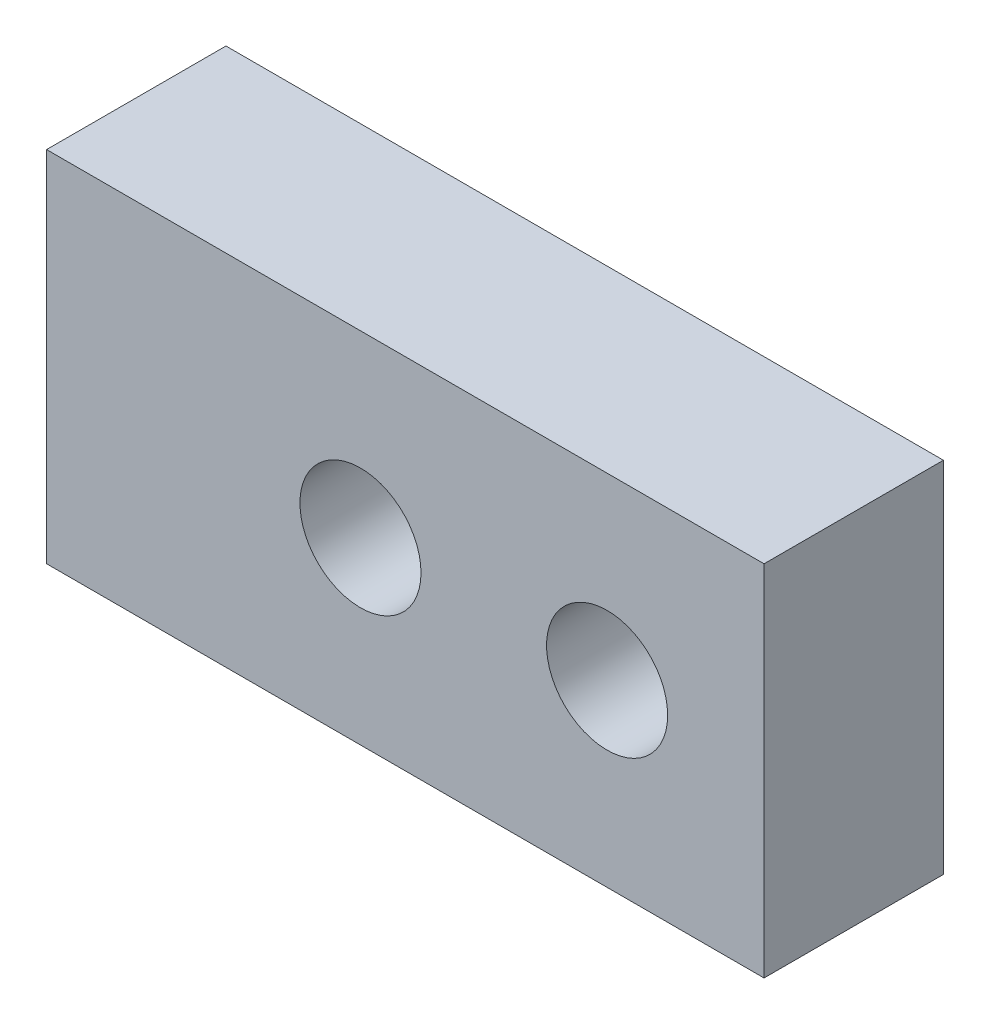
ISO-10303-21;
HEADER;
FILE_DESCRIPTION(('STEP AP214'),'2;1');
FILE_NAME('part.step','',(''),(''),'','','');
FILE_SCHEMA(('AUTOMOTIVE_DESIGN { 1 0 10303 214 1 1 1 1 }'));
ENDSEC;
DATA;
#1=APPLICATION_CONTEXT('core data for automotive mechanical design processes');
#2=APPLICATION_PROTOCOL_DEFINITION('international standard','automotive_design',2000,#1);
#3=PRODUCT_CONTEXT('',#1,'mechanical');
#4=PRODUCT('Part','Part','',(#3));
#5=PRODUCT_RELATED_PRODUCT_CATEGORY('part','',(#4));
#6=PRODUCT_DEFINITION_FORMATION('','',#4);
#7=PRODUCT_DEFINITION_CONTEXT('part definition',#1,'design');
#8=PRODUCT_DEFINITION('design','',#6,#7);
#9=PRODUCT_DEFINITION_SHAPE('','',#8);
#10=(LENGTH_UNIT() NAMED_UNIT(*) SI_UNIT(.MILLI.,.METRE.));
#11=(NAMED_UNIT(*) PLANE_ANGLE_UNIT() SI_UNIT($,.RADIAN.));
#12=(NAMED_UNIT(*) SI_UNIT($,.STERADIAN.) SOLID_ANGLE_UNIT());
#13=UNCERTAINTY_MEASURE_WITH_UNIT(LENGTH_MEASURE(1.E-05),#10,'distance_accuracy_value','');
#14=(GEOMETRIC_REPRESENTATION_CONTEXT(3) GLOBAL_UNCERTAINTY_ASSIGNED_CONTEXT((#13)) GLOBAL_UNIT_ASSIGNED_CONTEXT((#10,
#11,#12)) REPRESENTATION_CONTEXT('',''));
#15=CARTESIAN_POINT('',(0.,0.,0.));
#16=DIRECTION('',(0.,0.,1.));
#17=DIRECTION('',(1.,0.,0.));
#18=AXIS2_PLACEMENT_3D('',#15,#16,#17);
#19=CARTESIAN_POINT('',(0.,0.,4.));
#20=DIRECTION('',(0.,0.,-1.));
#21=DIRECTION('',(-1.,0.,0.));
#22=AXIS2_PLACEMENT_3D('',#19,#20,#21);
#23=PLANE('',#22);
#24=DIRECTION('',(0.,-1.,0.));
#25=VECTOR('',#24,1.);
#26=CARTESIAN_POINT('',(0.,0.,4.));
#27=LINE('',#26,#25);
#28=CARTESIAN_POINT('',(0.,8.,4.));
#29=VERTEX_POINT('',#28);
#30=CARTESIAN_POINT('',(0.,0.,4.));
#31=VERTEX_POINT('',#30);
#32=EDGE_CURVE('E92',#29,#31,#27,.T.);
#33=ORIENTED_EDGE('',*,*,#32,.T.);
#34=DIRECTION('',(1.,0.,0.));
#35=VECTOR('',#34,1.);
#36=CARTESIAN_POINT('',(0.,0.,4.));
#37=LINE('',#36,#35);
#38=CARTESIAN_POINT('',(16.,0.,4.));
#39=VERTEX_POINT('',#38);
#40=EDGE_CURVE('E87',#31,#39,#37,.T.);
#41=ORIENTED_EDGE('',*,*,#40,.T.);
#42=DIRECTION('',(0.,1.,0.));
#43=VECTOR('',#42,1.);
#44=CARTESIAN_POINT('',(16.,0.,4.));
#45=LINE('',#44,#43);
#46=CARTESIAN_POINT('',(16.,8.,4.));
#47=VERTEX_POINT('',#46);
#48=EDGE_CURVE('E90',#39,#47,#45,.T.);
#49=ORIENTED_EDGE('',*,*,#48,.T.);
#50=DIRECTION('',(-1.,0.,0.));
#51=VECTOR('',#50,1.);
#52=CARTESIAN_POINT('',(0.,8.,4.));
#53=LINE('',#52,#51);
#54=EDGE_CURVE('E57',#47,#29,#53,.T.);
#55=ORIENTED_EDGE('',*,*,#54,.T.);
#56=EDGE_LOOP('',(#33,#41,#49,#55));
#57=FACE_BOUND('',#56,.T.);
#58=CARTESIAN_POINT('',(12.5,4.,4.));
#59=DIRECTION('',(0.,0.,1.));
#60=DIRECTION('',(1.,0.,0.));
#61=AXIS2_PLACEMENT_3D('',#58,#59,#60);
#62=CIRCLE('',#61,1.35);
#63=CARTESIAN_POINT('',(13.85,4.,4.));
#64=VERTEX_POINT('',#63);
#65=EDGE_CURVE('E112',#64,#64,#62,.T.);
#66=ORIENTED_EDGE('',*,*,#65,.F.);
#67=EDGE_LOOP('',(#66));
#68=FACE_BOUND('',#67,.T.);
#69=CARTESIAN_POINT('',(7.,4.,4.));
#70=DIRECTION('',(0.,0.,1.));
#71=DIRECTION('',(1.,0.,0.));
#72=AXIS2_PLACEMENT_3D('',#69,#70,#71);
#73=CIRCLE('',#72,1.35);
#74=CARTESIAN_POINT('',(8.35,4.,4.));
#75=VERTEX_POINT('',#74);
#76=EDGE_CURVE('E134',#75,#75,#73,.T.);
#77=ORIENTED_EDGE('',*,*,#76,.F.);
#78=EDGE_LOOP('',(#77));
#79=FACE_BOUND('',#78,.T.);
#80=ADVANCED_FACE('F39',(#57,#68,#79),#23,.F.);
#81=CARTESIAN_POINT('',(0.,0.,0.));
#82=DIRECTION('',(0.,0.,-1.));
#83=DIRECTION('',(-1.,0.,0.));
#84=AXIS2_PLACEMENT_3D('',#81,#82,#83);
#85=PLANE('',#84);
#86=CARTESIAN_POINT('',(12.5,4.,0.));
#87=DIRECTION('',(0.,0.,1.));
#88=DIRECTION('',(1.,0.,0.));
#89=AXIS2_PLACEMENT_3D('',#86,#87,#88);
#90=CIRCLE('',#89,1.35);
#91=CARTESIAN_POINT('',(13.85,4.,0.));
#92=VERTEX_POINT('',#91);
#93=EDGE_CURVE('E130',#92,#92,#90,.T.);
#94=ORIENTED_EDGE('',*,*,#93,.T.);
#95=EDGE_LOOP('',(#94));
#96=FACE_BOUND('',#95,.T.);
#97=DIRECTION('',(0.,-1.,0.));
#98=VECTOR('',#97,1.);
#99=CARTESIAN_POINT('',(0.,0.,0.));
#100=LINE('',#99,#98);
#101=CARTESIAN_POINT('',(0.,8.,0.));
#102=VERTEX_POINT('',#101);
#103=CARTESIAN_POINT('',(0.,0.,0.));
#104=VERTEX_POINT('',#103);
#105=EDGE_CURVE('E108',#102,#104,#100,.T.);
#106=ORIENTED_EDGE('',*,*,#105,.F.);
#107=DIRECTION('',(-1.,0.,0.));
#108=VECTOR('',#107,1.);
#109=CARTESIAN_POINT('',(0.,8.,0.));
#110=LINE('',#109,#108);
#111=CARTESIAN_POINT('',(16.,8.,0.));
#112=VERTEX_POINT('',#111);
#113=EDGE_CURVE('E80',#112,#102,#110,.T.);
#114=ORIENTED_EDGE('',*,*,#113,.F.);
#115=DIRECTION('',(0.,1.,0.));
#116=VECTOR('',#115,1.);
#117=CARTESIAN_POINT('',(16.,0.,0.));
#118=LINE('',#117,#116);
#119=CARTESIAN_POINT('',(16.,0.,0.));
#120=VERTEX_POINT('',#119);
#121=EDGE_CURVE('E74',#120,#112,#118,.T.);
#122=ORIENTED_EDGE('',*,*,#121,.F.);
#123=DIRECTION('',(1.,0.,0.));
#124=VECTOR('',#123,1.);
#125=CARTESIAN_POINT('',(0.,0.,0.));
#126=LINE('',#125,#124);
#127=EDGE_CURVE('E97',#104,#120,#126,.T.);
#128=ORIENTED_EDGE('',*,*,#127,.F.);
#129=EDGE_LOOP('',(#106,#114,#122,#128));
#130=FACE_BOUND('',#129,.T.);
#131=CARTESIAN_POINT('',(7.,4.,0.));
#132=DIRECTION('',(0.,0.,1.));
#133=DIRECTION('',(1.,0.,0.));
#134=AXIS2_PLACEMENT_3D('',#131,#132,#133);
#135=CIRCLE('',#134,1.35);
#136=CARTESIAN_POINT('',(8.35,4.,0.));
#137=VERTEX_POINT('',#136);
#138=EDGE_CURVE('E138',#137,#137,#135,.T.);
#139=ORIENTED_EDGE('',*,*,#138,.T.);
#140=EDGE_LOOP('',(#139));
#141=FACE_BOUND('',#140,.T.);
#142=ADVANCED_FACE('F125',(#96,#130,#141),#85,.T.);
#143=CARTESIAN_POINT('',(0.,0.,4.));
#144=DIRECTION('',(1.,0.,0.));
#145=DIRECTION('',(0.,0.,-1.));
#146=AXIS2_PLACEMENT_3D('',#143,#144,#145);
#147=PLANE('',#146);
#148=ORIENTED_EDGE('',*,*,#105,.T.);
#149=DIRECTION('',(0.,0.,-1.));
#150=VECTOR('',#149,1.);
#151=CARTESIAN_POINT('',(0.,0.,4.));
#152=LINE('',#151,#150);
#153=EDGE_CURVE('E11',#31,#104,#152,.T.);
#154=ORIENTED_EDGE('',*,*,#153,.F.);
#155=ORIENTED_EDGE('',*,*,#32,.F.);
#156=DIRECTION('',(0.,0.,-1.));
#157=VECTOR('',#156,1.);
#158=CARTESIAN_POINT('',(0.,8.,4.));
#159=LINE('',#158,#157);
#160=EDGE_CURVE('E104',#29,#102,#159,.T.);
#161=ORIENTED_EDGE('',*,*,#160,.T.);
#162=EDGE_LOOP('',(#148,#154,#155,#161));
#163=FACE_BOUND('',#162,.T.);
#164=ADVANCED_FACE('F41',(#163),#147,.F.);
#165=CARTESIAN_POINT('',(0.,0.,4.));
#166=DIRECTION('',(0.,1.,0.));
#167=DIRECTION('',(0.,0.,1.));
#168=AXIS2_PLACEMENT_3D('',#165,#166,#167);
#169=PLANE('',#168);
#170=ORIENTED_EDGE('',*,*,#127,.T.);
#171=DIRECTION('',(0.,0.,-1.));
#172=VECTOR('',#171,1.);
#173=CARTESIAN_POINT('',(16.,0.,4.));
#174=LINE('',#173,#172);
#175=EDGE_CURVE('E49',#39,#120,#174,.T.);
#176=ORIENTED_EDGE('',*,*,#175,.F.);
#177=ORIENTED_EDGE('',*,*,#40,.F.);
#178=ORIENTED_EDGE('',*,*,#153,.T.);
#179=EDGE_LOOP('',(#170,#176,#177,#178));
#180=FACE_BOUND('',#179,.T.);
#181=ADVANCED_FACE('F96',(#180),#169,.F.);
#182=CARTESIAN_POINT('',(16.,0.,4.));
#183=DIRECTION('',(-1.,0.,0.));
#184=DIRECTION('',(0.,0.,1.));
#185=AXIS2_PLACEMENT_3D('',#182,#183,#184);
#186=PLANE('',#185);
#187=ORIENTED_EDGE('',*,*,#121,.T.);
#188=DIRECTION('',(0.,0.,-1.));
#189=VECTOR('',#188,1.);
#190=CARTESIAN_POINT('',(16.,8.,4.));
#191=LINE('',#190,#189);
#192=EDGE_CURVE('E99',#47,#112,#191,.T.);
#193=ORIENTED_EDGE('',*,*,#192,.F.);
#194=ORIENTED_EDGE('',*,*,#48,.F.);
#195=ORIENTED_EDGE('',*,*,#175,.T.);
#196=EDGE_LOOP('',(#187,#193,#194,#195));
#197=FACE_BOUND('',#196,.T.);
#198=ADVANCED_FACE('F100',(#197),#186,.F.);
#199=CARTESIAN_POINT('',(0.,8.,4.));
#200=DIRECTION('',(0.,-1.,0.));
#201=DIRECTION('',(0.,0.,-1.));
#202=AXIS2_PLACEMENT_3D('',#199,#200,#201);
#203=PLANE('',#202);
#204=ORIENTED_EDGE('',*,*,#113,.T.);
#205=ORIENTED_EDGE('',*,*,#160,.F.);
#206=ORIENTED_EDGE('',*,*,#54,.F.);
#207=ORIENTED_EDGE('',*,*,#192,.T.);
#208=EDGE_LOOP('',(#204,#205,#206,#207));
#209=FACE_BOUND('',#208,.T.);
#210=ADVANCED_FACE('F122',(#209),#203,.F.);
#211=CARTESIAN_POINT('',(12.5,4.,4.));
#212=DIRECTION('',(0.,0.,-1.));
#213=DIRECTION('',(-1.,0.,0.));
#214=AXIS2_PLACEMENT_3D('',#211,#212,#213);
#215=CYLINDRICAL_SURFACE('',#214,1.35);
#216=ORIENTED_EDGE('',*,*,#65,.T.);
#217=EDGE_LOOP('',(#216));
#218=FACE_BOUND('',#217,.T.);
#219=ORIENTED_EDGE('',*,*,#93,.F.);
#220=EDGE_LOOP('',(#219));
#221=FACE_BOUND('',#220,.T.);
#222=ADVANCED_FACE('F157',(#218,#221),#215,.F.);
#223=CARTESIAN_POINT('',(7.,4.,4.));
#224=DIRECTION('',(0.,0.,-1.));
#225=DIRECTION('',(-1.,0.,0.));
#226=AXIS2_PLACEMENT_3D('',#223,#224,#225);
#227=CYLINDRICAL_SURFACE('',#226,1.35);
#228=ORIENTED_EDGE('',*,*,#76,.T.);
#229=EDGE_LOOP('',(#228));
#230=FACE_BOUND('',#229,.T.);
#231=ORIENTED_EDGE('',*,*,#138,.F.);
#232=EDGE_LOOP('',(#231));
#233=FACE_BOUND('',#232,.T.);
#234=ADVANCED_FACE('F146',(#230,#233),#227,.F.);
#235=CLOSED_SHELL('',(#80,#142,#164,#181,#198,#210,#222,#234));
#236=MANIFOLD_SOLID_BREP('B2',#235);
#237=ADVANCED_BREP_SHAPE_REPRESENTATION('',(#18,#236),#14);
#238=SHAPE_DEFINITION_REPRESENTATION(#9,#237);
ENDSEC;
END-ISO-10303-21;
